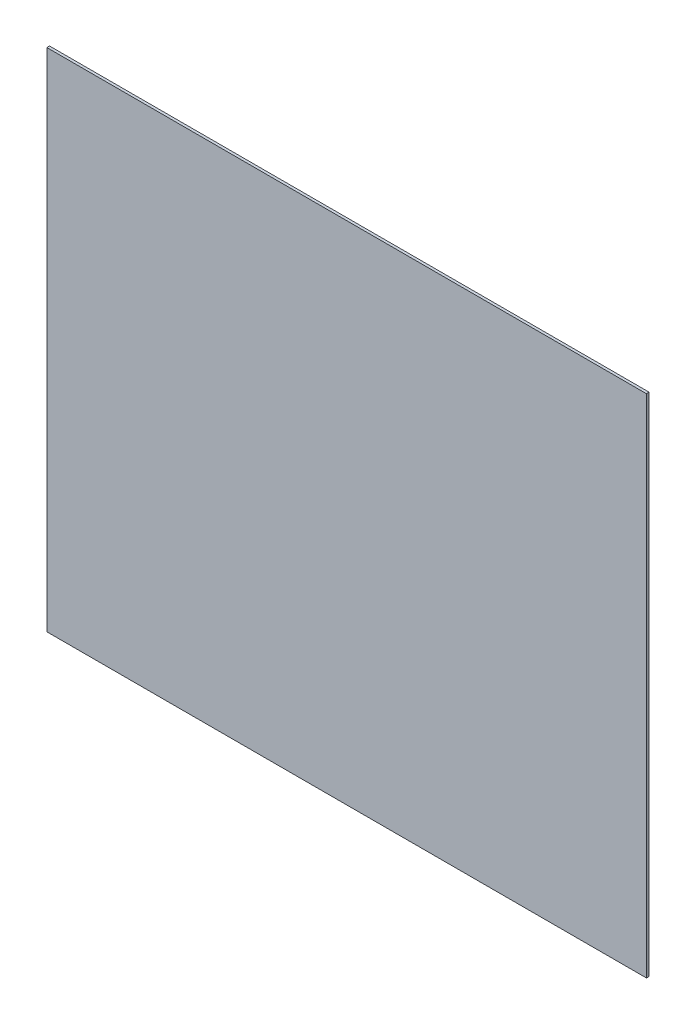
ISO-10303-21;
HEADER;
FILE_DESCRIPTION(('STEP AP214'),'2;1');
FILE_NAME('part.step','',(''),(''),'','','');
FILE_SCHEMA(('AUTOMOTIVE_DESIGN { 1 0 10303 214 1 1 1 1 }'));
ENDSEC;
DATA;
#1=APPLICATION_CONTEXT('core data for automotive mechanical design processes');
#2=APPLICATION_PROTOCOL_DEFINITION('international standard','automotive_design',2000,#1);
#3=PRODUCT_CONTEXT('',#1,'mechanical');
#4=PRODUCT('Part','Part','',(#3));
#5=PRODUCT_RELATED_PRODUCT_CATEGORY('part','',(#4));
#6=PRODUCT_DEFINITION_FORMATION('','',#4);
#7=PRODUCT_DEFINITION_CONTEXT('part definition',#1,'design');
#8=PRODUCT_DEFINITION('design','',#6,#7);
#9=PRODUCT_DEFINITION_SHAPE('','',#8);
#10=(LENGTH_UNIT() NAMED_UNIT(*) SI_UNIT(.MILLI.,.METRE.));
#11=(NAMED_UNIT(*) PLANE_ANGLE_UNIT() SI_UNIT($,.RADIAN.));
#12=(NAMED_UNIT(*) SI_UNIT($,.STERADIAN.) SOLID_ANGLE_UNIT());
#13=UNCERTAINTY_MEASURE_WITH_UNIT(LENGTH_MEASURE(1.E-05),#10,'distance_accuracy_value','');
#14=(GEOMETRIC_REPRESENTATION_CONTEXT(3) GLOBAL_UNCERTAINTY_ASSIGNED_CONTEXT((#13)) GLOBAL_UNIT_ASSIGNED_CONTEXT((#10,
#11,#12)) REPRESENTATION_CONTEXT('',''));
#15=CARTESIAN_POINT('',(0.,0.,0.));
#16=DIRECTION('',(0.,0.,1.));
#17=DIRECTION('',(1.,0.,0.));
#18=AXIS2_PLACEMENT_3D('',#15,#16,#17);
#19=CARTESIAN_POINT('',(-337.7,-285.,3.));
#20=DIRECTION('',(1.,0.,0.));
#21=DIRECTION('',(0.,0.,-1.));
#22=AXIS2_PLACEMENT_3D('',#19,#20,#21);
#23=PLANE('',#22);
#24=DIRECTION('',(0.,-1.,0.));
#25=VECTOR('',#24,1.);
#26=CARTESIAN_POINT('',(-337.7,-285.,0.));
#27=LINE('',#26,#25);
#28=CARTESIAN_POINT('',(-337.7,285.,0.));
#29=VERTEX_POINT('',#28);
#30=CARTESIAN_POINT('',(-337.7,-285.,0.));
#31=VERTEX_POINT('',#30);
#32=EDGE_CURVE('E96',#29,#31,#27,.T.);
#33=ORIENTED_EDGE('',*,*,#32,.T.);
#34=DIRECTION('',(0.,0.,-1.));
#35=VECTOR('',#34,1.);
#36=CARTESIAN_POINT('',(-337.7,-285.,3.));
#37=LINE('',#36,#35);
#38=CARTESIAN_POINT('',(-337.7,-285.,3.));
#39=VERTEX_POINT('',#38);
#40=EDGE_CURVE('E11',#39,#31,#37,.T.);
#41=ORIENTED_EDGE('',*,*,#40,.F.);
#42=DIRECTION('',(0.,-1.,0.));
#43=VECTOR('',#42,1.);
#44=CARTESIAN_POINT('',(-337.7,-285.,3.));
#45=LINE('',#44,#43);
#46=CARTESIAN_POINT('',(-337.7,285.,3.));
#47=VERTEX_POINT('',#46);
#48=EDGE_CURVE('E84',#47,#39,#45,.T.);
#49=ORIENTED_EDGE('',*,*,#48,.F.);
#50=DIRECTION('',(0.,0.,-1.));
#51=VECTOR('',#50,1.);
#52=CARTESIAN_POINT('',(-337.7,285.,3.));
#53=LINE('',#52,#51);
#54=EDGE_CURVE('E92',#47,#29,#53,.T.);
#55=ORIENTED_EDGE('',*,*,#54,.T.);
#56=EDGE_LOOP('',(#33,#41,#49,#55));
#57=FACE_BOUND('',#56,.T.);
#58=ADVANCED_FACE('F33',(#57),#23,.F.);
#59=CARTESIAN_POINT('',(337.7,-285.,3.));
#60=DIRECTION('',(0.,1.,0.));
#61=DIRECTION('',(-1.,0.,0.));
#62=AXIS2_PLACEMENT_3D('',#59,#60,#61);
#63=PLANE('',#62);
#64=DIRECTION('',(1.,0.,0.));
#65=VECTOR('',#64,1.);
#66=CARTESIAN_POINT('',(337.7,-285.,0.));
#67=LINE('',#66,#65);
#68=CARTESIAN_POINT('',(337.7,-285.,0.));
#69=VERTEX_POINT('',#68);
#70=EDGE_CURVE('E88',#31,#69,#67,.T.);
#71=ORIENTED_EDGE('',*,*,#70,.T.);
#72=DIRECTION('',(0.,0.,-1.));
#73=VECTOR('',#72,1.);
#74=CARTESIAN_POINT('',(337.7,-285.,3.));
#75=LINE('',#74,#73);
#76=CARTESIAN_POINT('',(337.7,-285.,3.));
#77=VERTEX_POINT('',#76);
#78=EDGE_CURVE('E41',#77,#69,#75,.T.);
#79=ORIENTED_EDGE('',*,*,#78,.F.);
#80=DIRECTION('',(1.,0.,0.));
#81=VECTOR('',#80,1.);
#82=CARTESIAN_POINT('',(337.7,-285.,3.));
#83=LINE('',#82,#81);
#84=EDGE_CURVE('E79',#39,#77,#83,.T.);
#85=ORIENTED_EDGE('',*,*,#84,.F.);
#86=ORIENTED_EDGE('',*,*,#40,.T.);
#87=EDGE_LOOP('',(#71,#79,#85,#86));
#88=FACE_BOUND('',#87,.T.);
#89=ADVANCED_FACE('F87',(#88),#63,.F.);
#90=CARTESIAN_POINT('',(337.7,-285.,3.));
#91=DIRECTION('',(-1.,0.,0.));
#92=DIRECTION('',(0.,0.,1.));
#93=AXIS2_PLACEMENT_3D('',#90,#91,#92);
#94=PLANE('',#93);
#95=DIRECTION('',(0.,1.,0.));
#96=VECTOR('',#95,1.);
#97=CARTESIAN_POINT('',(337.7,-285.,0.));
#98=LINE('',#97,#96);
#99=CARTESIAN_POINT('',(337.7,285.,0.));
#100=VERTEX_POINT('',#99);
#101=EDGE_CURVE('E66',#69,#100,#98,.T.);
#102=ORIENTED_EDGE('',*,*,#101,.T.);
#103=DIRECTION('',(0.,0.,-1.));
#104=VECTOR('',#103,1.);
#105=CARTESIAN_POINT('',(337.7,285.,3.));
#106=LINE('',#105,#104);
#107=CARTESIAN_POINT('',(337.7,285.,3.));
#108=VERTEX_POINT('',#107);
#109=EDGE_CURVE('E89',#108,#100,#106,.T.);
#110=ORIENTED_EDGE('',*,*,#109,.F.);
#111=DIRECTION('',(0.,1.,0.));
#112=VECTOR('',#111,1.);
#113=CARTESIAN_POINT('',(337.7,-285.,3.));
#114=LINE('',#113,#112);
#115=EDGE_CURVE('E82',#77,#108,#114,.T.);
#116=ORIENTED_EDGE('',*,*,#115,.F.);
#117=ORIENTED_EDGE('',*,*,#78,.T.);
#118=EDGE_LOOP('',(#102,#110,#116,#117));
#119=FACE_BOUND('',#118,.T.);
#120=ADVANCED_FACE('F90',(#119),#94,.F.);
#121=CARTESIAN_POINT('',(337.7,285.,3.));
#122=DIRECTION('',(0.,-1.,0.));
#123=DIRECTION('',(1.,0.,0.));
#124=AXIS2_PLACEMENT_3D('',#121,#122,#123);
#125=PLANE('',#124);
#126=DIRECTION('',(-1.,0.,0.));
#127=VECTOR('',#126,1.);
#128=CARTESIAN_POINT('',(337.7,285.,0.));
#129=LINE('',#128,#127);
#130=EDGE_CURVE('E72',#100,#29,#129,.T.);
#131=ORIENTED_EDGE('',*,*,#130,.T.);
#132=ORIENTED_EDGE('',*,*,#54,.F.);
#133=DIRECTION('',(-1.,0.,0.));
#134=VECTOR('',#133,1.);
#135=CARTESIAN_POINT('',(337.7,285.,3.));
#136=LINE('',#135,#134);
#137=EDGE_CURVE('E49',#108,#47,#136,.T.);
#138=ORIENTED_EDGE('',*,*,#137,.F.);
#139=ORIENTED_EDGE('',*,*,#109,.T.);
#140=EDGE_LOOP('',(#131,#132,#138,#139));
#141=FACE_BOUND('',#140,.T.);
#142=ADVANCED_FACE('F103',(#141),#125,.F.);
#143=CARTESIAN_POINT('',(0.,0.,3.));
#144=DIRECTION('',(0.,0.,1.));
#145=DIRECTION('',(1.,0.,0.));
#146=AXIS2_PLACEMENT_3D('',#143,#144,#145);
#147=PLANE('',#146);
#148=ORIENTED_EDGE('',*,*,#48,.T.);
#149=ORIENTED_EDGE('',*,*,#84,.T.);
#150=ORIENTED_EDGE('',*,*,#115,.T.);
#151=ORIENTED_EDGE('',*,*,#137,.T.);
#152=EDGE_LOOP('',(#148,#149,#150,#151));
#153=FACE_BOUND('',#152,.T.);
#154=ADVANCED_FACE('F80',(#153),#147,.T.);
#155=CARTESIAN_POINT('',(0.,0.,0.));
#156=DIRECTION('',(0.,0.,1.));
#157=DIRECTION('',(1.,0.,0.));
#158=AXIS2_PLACEMENT_3D('',#155,#156,#157);
#159=PLANE('',#158);
#160=ORIENTED_EDGE('',*,*,#32,.F.);
#161=ORIENTED_EDGE('',*,*,#130,.F.);
#162=ORIENTED_EDGE('',*,*,#101,.F.);
#163=ORIENTED_EDGE('',*,*,#70,.F.);
#164=EDGE_LOOP('',(#160,#161,#162,#163));
#165=FACE_BOUND('',#164,.T.);
#166=ADVANCED_FACE('F106',(#165),#159,.F.);
#167=CLOSED_SHELL('',(#58,#89,#120,#142,#154,#166));
#168=MANIFOLD_SOLID_BREP('B2',#167);
#169=ADVANCED_BREP_SHAPE_REPRESENTATION('',(#18,#168),#14);
#170=SHAPE_DEFINITION_REPRESENTATION(#9,#169);
ENDSEC;
END-ISO-10303-21;
